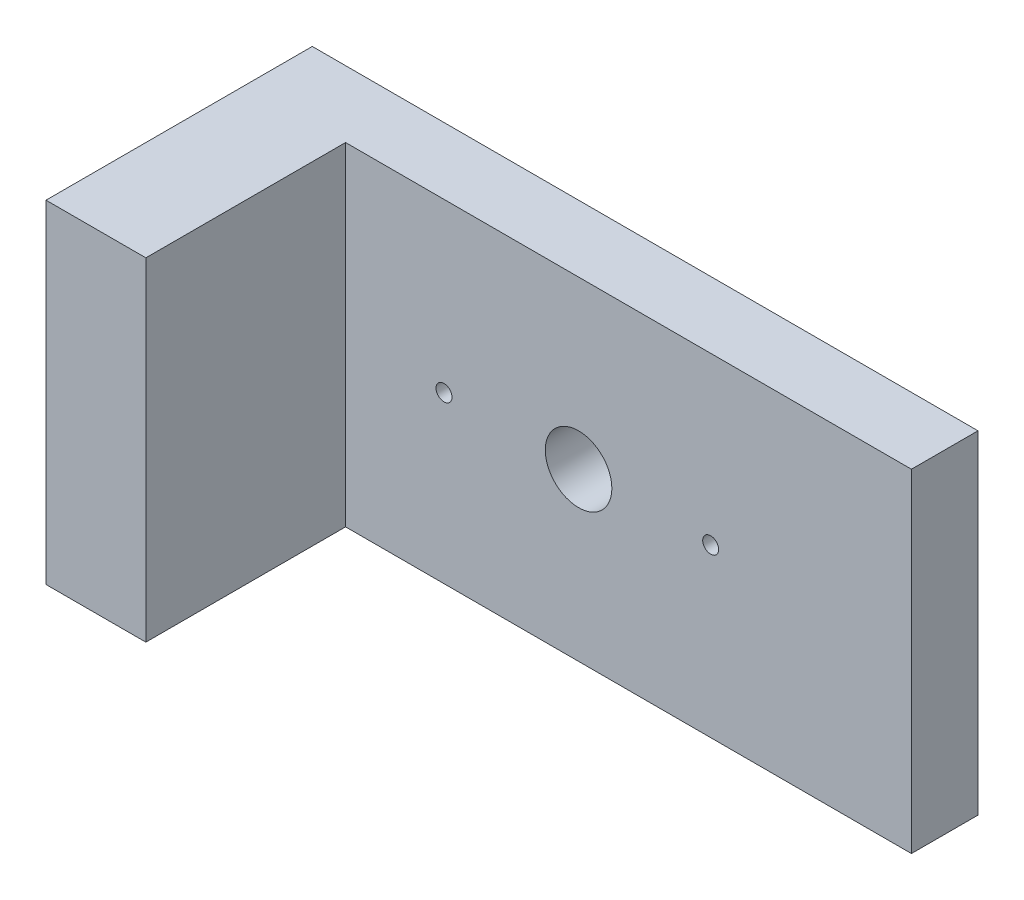
ISO-10303-21;
HEADER;
FILE_DESCRIPTION(('STEP AP214'),'2;1');
FILE_NAME('part.step','',(''),(''),'','','');
FILE_SCHEMA(('AUTOMOTIVE_DESIGN { 1 0 10303 214 1 1 1 1 }'));
ENDSEC;
DATA;
#1=APPLICATION_CONTEXT('core data for automotive mechanical design processes');
#2=APPLICATION_PROTOCOL_DEFINITION('international standard','automotive_design',2000,#1);
#3=PRODUCT_CONTEXT('',#1,'mechanical');
#4=PRODUCT('Part','Part','',(#3));
#5=PRODUCT_RELATED_PRODUCT_CATEGORY('part','',(#4));
#6=PRODUCT_DEFINITION_FORMATION('','',#4);
#7=PRODUCT_DEFINITION_CONTEXT('part definition',#1,'design');
#8=PRODUCT_DEFINITION('design','',#6,#7);
#9=PRODUCT_DEFINITION_SHAPE('','',#8);
#10=(LENGTH_UNIT() NAMED_UNIT(*) SI_UNIT(.MILLI.,.METRE.));
#11=(NAMED_UNIT(*) PLANE_ANGLE_UNIT() SI_UNIT($,.RADIAN.));
#12=(NAMED_UNIT(*) SI_UNIT($,.STERADIAN.) SOLID_ANGLE_UNIT());
#13=UNCERTAINTY_MEASURE_WITH_UNIT(LENGTH_MEASURE(1.E-05),#10,'distance_accuracy_value','');
#14=(GEOMETRIC_REPRESENTATION_CONTEXT(3) GLOBAL_UNCERTAINTY_ASSIGNED_CONTEXT((#13)) GLOBAL_UNIT_ASSIGNED_CONTEXT((#10,
#11,#12)) REPRESENTATION_CONTEXT('',''));
#15=CARTESIAN_POINT('',(0.,0.,0.));
#16=DIRECTION('',(0.,0.,1.));
#17=DIRECTION('',(1.,0.,0.));
#18=AXIS2_PLACEMENT_3D('',#15,#16,#17);
#19=CARTESIAN_POINT('',(0.,0.,10.));
#20=DIRECTION('',(0.,0.,-1.));
#21=DIRECTION('',(-1.,0.,0.));
#22=AXIS2_PLACEMENT_3D('',#19,#20,#21);
#23=PLANE('',#22);
#24=CARTESIAN_POINT('',(19.8437655180896,0.069021112608425,10.));
#25=DIRECTION('',(0.,0.,1.));
#26=DIRECTION('',(1.,0.,0.));
#27=AXIS2_PLACEMENT_3D('',#24,#25,#26);
#28=CIRCLE('',#27,1.2);
#29=CARTESIAN_POINT('',(21.0437655180896,0.069021112608425,10.));
#30=VERTEX_POINT('',#29);
#31=EDGE_CURVE('E161',#30,#30,#28,.T.);
#32=ORIENTED_EDGE('',*,*,#31,.F.);
#33=EDGE_LOOP('',(#32));
#34=FACE_BOUND('',#33,.T.);
#35=CARTESIAN_POINT('',(-20.2130249273864,-0.14496122133778,10.));
#36=DIRECTION('',(0.,0.,1.));
#37=DIRECTION('',(1.,0.,0.));
#38=AXIS2_PLACEMENT_3D('',#35,#36,#37);
#39=CIRCLE('',#38,1.2);
#40=CARTESIAN_POINT('',(-19.0130249273864,-0.14496122133778,10.));
#41=VERTEX_POINT('',#40);
#42=EDGE_CURVE('E155',#41,#41,#39,.T.);
#43=ORIENTED_EDGE('',*,*,#42,.F.);
#44=EDGE_LOOP('',(#43));
#45=FACE_BOUND('',#44,.T.);
#46=CARTESIAN_POINT('',(0.,0.,10.));
#47=DIRECTION('',(0.,0.,1.));
#48=DIRECTION('',(1.,0.,0.));
#49=AXIS2_PLACEMENT_3D('',#46,#47,#48);
#50=CIRCLE('',#49,5.);
#51=CARTESIAN_POINT('',(5.,0.,10.));
#52=VERTEX_POINT('',#51);
#53=EDGE_CURVE('E139',#52,#52,#50,.T.);
#54=ORIENTED_EDGE('',*,*,#53,.F.);
#55=EDGE_LOOP('',(#54));
#56=FACE_BOUND('',#55,.T.);
#57=DIRECTION('',(0.,1.,0.));
#58=VECTOR('',#57,1.);
#59=CARTESIAN_POINT('',(-35.,25.,10.));
#60=LINE('',#59,#58);
#61=CARTESIAN_POINT('',(-35.,-25.,10.));
#62=VERTEX_POINT('',#61);
#63=CARTESIAN_POINT('',(-35.,25.,10.));
#64=VERTEX_POINT('',#63);
#65=EDGE_CURVE('E54',#62,#64,#60,.T.);
#66=ORIENTED_EDGE('',*,*,#65,.F.);
#67=DIRECTION('',(1.,0.,0.));
#68=VECTOR('',#67,1.);
#69=CARTESIAN_POINT('',(-50.,-25.,10.));
#70=LINE('',#69,#68);
#71=CARTESIAN_POINT('',(50.,-25.,10.));
#72=VERTEX_POINT('',#71);
#73=EDGE_CURVE('E59',#62,#72,#70,.T.);
#74=ORIENTED_EDGE('',*,*,#73,.T.);
#75=DIRECTION('',(0.,1.,0.));
#76=VECTOR('',#75,1.);
#77=CARTESIAN_POINT('',(50.,-25.,10.));
#78=LINE('',#77,#76);
#79=CARTESIAN_POINT('',(50.,25.,10.));
#80=VERTEX_POINT('',#79);
#81=EDGE_CURVE('E90',#72,#80,#78,.T.);
#82=ORIENTED_EDGE('',*,*,#81,.T.);
#83=DIRECTION('',(-1.,0.,0.));
#84=VECTOR('',#83,1.);
#85=CARTESIAN_POINT('',(-50.,25.,10.));
#86=LINE('',#85,#84);
#87=EDGE_CURVE('E141',#80,#64,#86,.T.);
#88=ORIENTED_EDGE('',*,*,#87,.T.);
#89=EDGE_LOOP('',(#66,#74,#82,#88));
#90=FACE_BOUND('',#89,.T.);
#91=ADVANCED_FACE('F39',(#34,#45,#56,#90),#23,.F.);
#92=CARTESIAN_POINT('',(50.,-25.,10.));
#93=DIRECTION('',(-1.,0.,0.));
#94=DIRECTION('',(0.,0.,1.));
#95=AXIS2_PLACEMENT_3D('',#92,#93,#94);
#96=PLANE('',#95);
#97=DIRECTION('',(0.,1.,0.));
#98=VECTOR('',#97,1.);
#99=CARTESIAN_POINT('',(50.,-25.,0.));
#100=LINE('',#99,#98);
#101=CARTESIAN_POINT('',(50.,-25.,0.));
#102=VERTEX_POINT('',#101);
#103=CARTESIAN_POINT('',(50.,25.,0.));
#104=VERTEX_POINT('',#103);
#105=EDGE_CURVE('E96',#102,#104,#100,.T.);
#106=ORIENTED_EDGE('',*,*,#105,.T.);
#107=DIRECTION('',(0.,0.,-1.));
#108=VECTOR('',#107,1.);
#109=CARTESIAN_POINT('',(50.,25.,10.));
#110=LINE('',#109,#108);
#111=EDGE_CURVE('E11',#80,#104,#110,.T.);
#112=ORIENTED_EDGE('',*,*,#111,.F.);
#113=ORIENTED_EDGE('',*,*,#81,.F.);
#114=DIRECTION('',(0.,0.,-1.));
#115=VECTOR('',#114,1.);
#116=CARTESIAN_POINT('',(50.,-25.,10.));
#117=LINE('',#116,#115);
#118=EDGE_CURVE('E82',#72,#102,#117,.T.);
#119=ORIENTED_EDGE('',*,*,#118,.T.);
#120=EDGE_LOOP('',(#106,#112,#113,#119));
#121=FACE_BOUND('',#120,.T.);
#122=ADVANCED_FACE('F41',(#121),#96,.F.);
#123=CARTESIAN_POINT('',(-50.,25.,10.));
#124=DIRECTION('',(0.,-1.,0.));
#125=DIRECTION('',(0.,0.,-1.));
#126=AXIS2_PLACEMENT_3D('',#123,#124,#125);
#127=PLANE('',#126);
#128=DIRECTION('',(-1.,0.,0.));
#129=VECTOR('',#128,1.);
#130=CARTESIAN_POINT('',(-50.,25.,0.));
#131=LINE('',#130,#129);
#132=CARTESIAN_POINT('',(-50.,25.,0.));
#133=VERTEX_POINT('',#132);
#134=EDGE_CURVE('E99',#104,#133,#131,.T.);
#135=ORIENTED_EDGE('',*,*,#134,.T.);
#136=DIRECTION('',(0.,0.,-1.));
#137=VECTOR('',#136,1.);
#138=CARTESIAN_POINT('',(-50.,25.,10.));
#139=LINE('',#138,#137);
#140=CARTESIAN_POINT('',(-50.,25.,40.));
#141=VERTEX_POINT('',#140);
#142=EDGE_CURVE('E47',#141,#133,#139,.T.);
#143=ORIENTED_EDGE('',*,*,#142,.F.);
#144=DIRECTION('',(-1.,0.,0.));
#145=VECTOR('',#144,1.);
#146=CARTESIAN_POINT('',(-50.,25.,40.));
#147=LINE('',#146,#145);
#148=CARTESIAN_POINT('',(-35.,25.,40.));
#149=VERTEX_POINT('',#148);
#150=EDGE_CURVE('E123',#149,#141,#147,.T.);
#151=ORIENTED_EDGE('',*,*,#150,.F.);
#152=DIRECTION('',(0.,0.,-1.));
#153=VECTOR('',#152,1.);
#154=CARTESIAN_POINT('',(-35.,25.,40.));
#155=LINE('',#154,#153);
#156=EDGE_CURVE('E104',#149,#64,#155,.T.);
#157=ORIENTED_EDGE('',*,*,#156,.T.);
#158=ORIENTED_EDGE('',*,*,#87,.F.);
#159=ORIENTED_EDGE('',*,*,#111,.T.);
#160=EDGE_LOOP('',(#135,#143,#151,#157,#158,#159));
#161=FACE_BOUND('',#160,.T.);
#162=ADVANCED_FACE('F120',(#161),#127,.F.);
#163=CARTESIAN_POINT('',(-50.,-25.,10.));
#164=DIRECTION('',(1.,0.,0.));
#165=DIRECTION('',(0.,0.,-1.));
#166=AXIS2_PLACEMENT_3D('',#163,#164,#165);
#167=PLANE('',#166);
#168=DIRECTION('',(0.,-1.,0.));
#169=VECTOR('',#168,1.);
#170=CARTESIAN_POINT('',(-50.,-25.,0.));
#171=LINE('',#170,#169);
#172=CARTESIAN_POINT('',(-50.,-25.,0.));
#173=VERTEX_POINT('',#172);
#174=EDGE_CURVE('E91',#133,#173,#171,.T.);
#175=ORIENTED_EDGE('',*,*,#174,.T.);
#176=DIRECTION('',(0.,0.,-1.));
#177=VECTOR('',#176,1.);
#178=CARTESIAN_POINT('',(-50.,-25.,10.));
#179=LINE('',#178,#177);
#180=CARTESIAN_POINT('',(-50.,-25.,40.));
#181=VERTEX_POINT('',#180);
#182=EDGE_CURVE('E86',#181,#173,#179,.T.);
#183=ORIENTED_EDGE('',*,*,#182,.F.);
#184=DIRECTION('',(0.,-1.,0.));
#185=VECTOR('',#184,1.);
#186=CARTESIAN_POINT('',(-50.,25.,40.));
#187=LINE('',#186,#185);
#188=EDGE_CURVE('E116',#141,#181,#187,.T.);
#189=ORIENTED_EDGE('',*,*,#188,.F.);
#190=ORIENTED_EDGE('',*,*,#142,.T.);
#191=EDGE_LOOP('',(#175,#183,#189,#190));
#192=FACE_BOUND('',#191,.T.);
#193=ADVANCED_FACE('F114',(#192),#167,.F.);
#194=CARTESIAN_POINT('',(-50.,-25.,10.));
#195=DIRECTION('',(0.,1.,0.));
#196=DIRECTION('',(0.,0.,1.));
#197=AXIS2_PLACEMENT_3D('',#194,#195,#196);
#198=PLANE('',#197);
#199=DIRECTION('',(1.,0.,0.));
#200=VECTOR('',#199,1.);
#201=CARTESIAN_POINT('',(-50.,-25.,0.));
#202=LINE('',#201,#200);
#203=EDGE_CURVE('E79',#173,#102,#202,.T.);
#204=ORIENTED_EDGE('',*,*,#203,.T.);
#205=ORIENTED_EDGE('',*,*,#118,.F.);
#206=ORIENTED_EDGE('',*,*,#73,.F.);
#207=DIRECTION('',(0.,0.,-1.));
#208=VECTOR('',#207,1.);
#209=CARTESIAN_POINT('',(-35.,-25.,40.));
#210=LINE('',#209,#208);
#211=CARTESIAN_POINT('',(-35.,-25.,40.));
#212=VERTEX_POINT('',#211);
#213=EDGE_CURVE('E100',#212,#62,#210,.T.);
#214=ORIENTED_EDGE('',*,*,#213,.F.);
#215=DIRECTION('',(1.,0.,0.));
#216=VECTOR('',#215,1.);
#217=CARTESIAN_POINT('',(-50.,-25.,40.));
#218=LINE('',#217,#216);
#219=EDGE_CURVE('E135',#181,#212,#218,.T.);
#220=ORIENTED_EDGE('',*,*,#219,.F.);
#221=ORIENTED_EDGE('',*,*,#182,.T.);
#222=EDGE_LOOP('',(#204,#205,#206,#214,#220,#221));
#223=FACE_BOUND('',#222,.T.);
#224=ADVANCED_FACE('F81',(#223),#198,.F.);
#225=CARTESIAN_POINT('',(0.,0.,0.));
#226=DIRECTION('',(0.,0.,-1.));
#227=DIRECTION('',(-1.,0.,0.));
#228=AXIS2_PLACEMENT_3D('',#225,#226,#227);
#229=PLANE('',#228);
#230=CARTESIAN_POINT('',(19.8437655180896,0.069021112608425,0.));
#231=DIRECTION('',(0.,0.,-1.));
#232=DIRECTION('',(-1.,0.,0.));
#233=AXIS2_PLACEMENT_3D('',#230,#231,#232);
#234=CIRCLE('',#233,1.2);
#235=CARTESIAN_POINT('',(18.6437655180896,0.069021112608425,0.));
#236=VERTEX_POINT('',#235);
#237=EDGE_CURVE('E164',#236,#236,#234,.F.);
#238=ORIENTED_EDGE('',*,*,#237,.T.);
#239=EDGE_LOOP('',(#238));
#240=FACE_BOUND('',#239,.T.);
#241=CARTESIAN_POINT('',(-20.2130249273864,-0.14496122133778,0.));
#242=DIRECTION('',(0.,0.,-1.));
#243=DIRECTION('',(-1.,0.,0.));
#244=AXIS2_PLACEMENT_3D('',#241,#242,#243);
#245=CIRCLE('',#244,1.2);
#246=CARTESIAN_POINT('',(-21.4130249273864,-0.14496122133778,0.));
#247=VERTEX_POINT('',#246);
#248=EDGE_CURVE('E158',#247,#247,#245,.F.);
#249=ORIENTED_EDGE('',*,*,#248,.T.);
#250=EDGE_LOOP('',(#249));
#251=FACE_BOUND('',#250,.T.);
#252=CARTESIAN_POINT('',(0.,0.,0.));
#253=DIRECTION('',(0.,0.,-1.));
#254=DIRECTION('',(-1.,0.,0.));
#255=AXIS2_PLACEMENT_3D('',#252,#253,#254);
#256=CIRCLE('',#255,5.);
#257=CARTESIAN_POINT('',(-5.,0.,0.));
#258=VERTEX_POINT('',#257);
#259=EDGE_CURVE('E152',#258,#258,#256,.F.);
#260=ORIENTED_EDGE('',*,*,#259,.T.);
#261=EDGE_LOOP('',(#260));
#262=FACE_BOUND('',#261,.T.);
#263=ORIENTED_EDGE('',*,*,#105,.F.);
#264=ORIENTED_EDGE('',*,*,#203,.F.);
#265=ORIENTED_EDGE('',*,*,#174,.F.);
#266=ORIENTED_EDGE('',*,*,#134,.F.);
#267=EDGE_LOOP('',(#263,#264,#265,#266));
#268=FACE_BOUND('',#267,.T.);
#269=ADVANCED_FACE('F98',(#240,#251,#262,#268),#229,.T.);
#270=CARTESIAN_POINT('',(-35.,25.,40.));
#271=DIRECTION('',(-1.,0.,0.));
#272=DIRECTION('',(0.,-1.,0.));
#273=AXIS2_PLACEMENT_3D('',#270,#271,#272);
#274=PLANE('',#273);
#275=ORIENTED_EDGE('',*,*,#65,.T.);
#276=ORIENTED_EDGE('',*,*,#156,.F.);
#277=DIRECTION('',(0.,1.,0.));
#278=VECTOR('',#277,1.);
#279=CARTESIAN_POINT('',(-35.,25.,40.));
#280=LINE('',#279,#278);
#281=EDGE_CURVE('E131',#212,#149,#280,.T.);
#282=ORIENTED_EDGE('',*,*,#281,.F.);
#283=ORIENTED_EDGE('',*,*,#213,.T.);
#284=EDGE_LOOP('',(#275,#276,#282,#283));
#285=FACE_BOUND('',#284,.T.);
#286=ADVANCED_FACE('F144',(#285),#274,.F.);
#287=CARTESIAN_POINT('',(0.,0.,40.));
#288=DIRECTION('',(0.,0.,1.));
#289=DIRECTION('',(1.,0.,0.));
#290=AXIS2_PLACEMENT_3D('',#287,#288,#289);
#291=PLANE('',#290);
#292=ORIENTED_EDGE('',*,*,#188,.T.);
#293=ORIENTED_EDGE('',*,*,#219,.T.);
#294=ORIENTED_EDGE('',*,*,#281,.T.);
#295=ORIENTED_EDGE('',*,*,#150,.T.);
#296=EDGE_LOOP('',(#292,#293,#294,#295));
#297=FACE_BOUND('',#296,.T.);
#298=ADVANCED_FACE('F127',(#297),#291,.T.);
#299=CARTESIAN_POINT('',(0.,0.,-0.000999999999999265));
#300=DIRECTION('',(0.,0.,1.));
#301=DIRECTION('',(1.,0.,0.));
#302=AXIS2_PLACEMENT_3D('',#299,#300,#301);
#303=CYLINDRICAL_SURFACE('',#302,5.);
#304=ORIENTED_EDGE('',*,*,#259,.F.);
#305=EDGE_LOOP('',(#304));
#306=FACE_BOUND('',#305,.T.);
#307=ORIENTED_EDGE('',*,*,#53,.T.);
#308=EDGE_LOOP('',(#307));
#309=FACE_BOUND('',#308,.T.);
#310=ADVANCED_FACE('F179',(#306,#309),#303,.F.);
#311=CARTESIAN_POINT('',(-20.2130249273864,-0.14496122133778,-0.000999999999999265));
#312=DIRECTION('',(0.,0.,1.));
#313=DIRECTION('',(1.,0.,0.));
#314=AXIS2_PLACEMENT_3D('',#311,#312,#313);
#315=CYLINDRICAL_SURFACE('',#314,1.2);
#316=ORIENTED_EDGE('',*,*,#248,.F.);
#317=EDGE_LOOP('',(#316));
#318=FACE_BOUND('',#317,.T.);
#319=ORIENTED_EDGE('',*,*,#42,.T.);
#320=EDGE_LOOP('',(#319));
#321=FACE_BOUND('',#320,.T.);
#322=ADVANCED_FACE('F181',(#318,#321),#315,.F.);
#323=CARTESIAN_POINT('',(19.8437655180896,0.069021112608425,-0.000999999999999265));
#324=DIRECTION('',(0.,0.,1.));
#325=DIRECTION('',(1.,0.,0.));
#326=AXIS2_PLACEMENT_3D('',#323,#324,#325);
#327=CYLINDRICAL_SURFACE('',#326,1.2);
#328=ORIENTED_EDGE('',*,*,#237,.F.);
#329=EDGE_LOOP('',(#328));
#330=FACE_BOUND('',#329,.T.);
#331=ORIENTED_EDGE('',*,*,#31,.T.);
#332=EDGE_LOOP('',(#331));
#333=FACE_BOUND('',#332,.T.);
#334=ADVANCED_FACE('F170',(#330,#333),#327,.F.);
#335=CLOSED_SHELL('',(#91,#122,#162,#193,#224,#269,#286,#298,#310,#322,#334));
#336=MANIFOLD_SOLID_BREP('B2',#335);
#337=ADVANCED_BREP_SHAPE_REPRESENTATION('',(#18,#336),#14);
#338=SHAPE_DEFINITION_REPRESENTATION(#9,#337);
ENDSEC;
END-ISO-10303-21;
